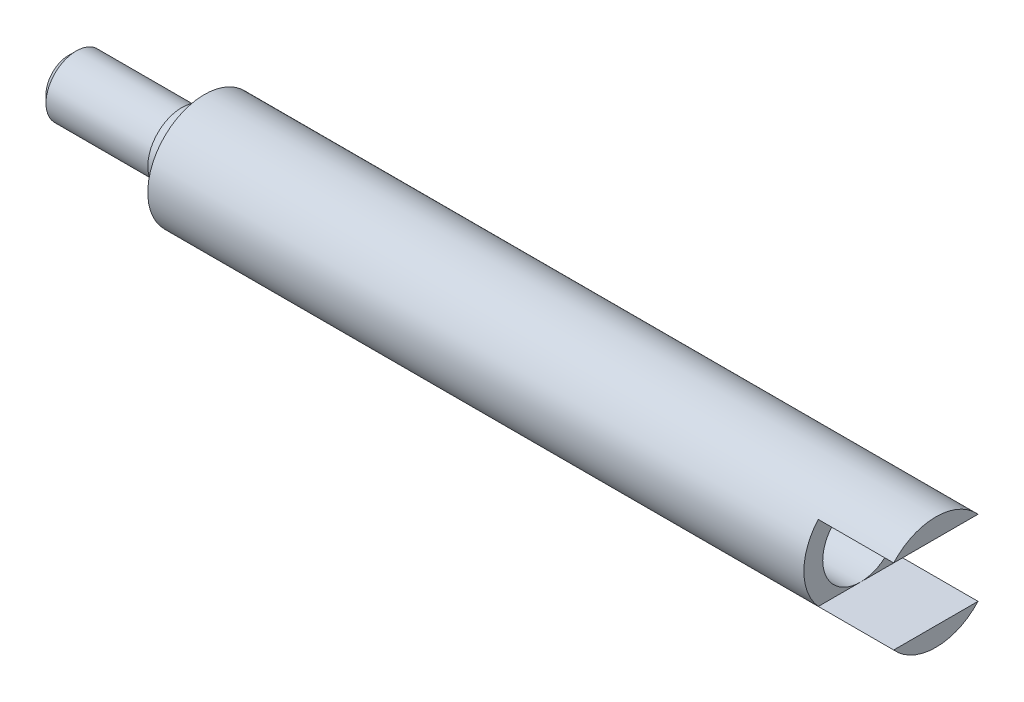
ISO-10303-21;
HEADER;
FILE_DESCRIPTION(('STEP AP214'),'2;1');
FILE_NAME('part.step','',(''),(''),'','','');
FILE_SCHEMA(('AUTOMOTIVE_DESIGN { 1 0 10303 214 1 1 1 1 }'));
ENDSEC;
DATA;
#1=APPLICATION_CONTEXT('core data for automotive mechanical design processes');
#2=APPLICATION_PROTOCOL_DEFINITION('international standard','automotive_design',2000,#1);
#3=PRODUCT_CONTEXT('',#1,'mechanical');
#4=PRODUCT('Part','Part','',(#3));
#5=PRODUCT_RELATED_PRODUCT_CATEGORY('part','',(#4));
#6=PRODUCT_DEFINITION_FORMATION('','',#4);
#7=PRODUCT_DEFINITION_CONTEXT('part definition',#1,'design');
#8=PRODUCT_DEFINITION('design','',#6,#7);
#9=PRODUCT_DEFINITION_SHAPE('','',#8);
#10=(LENGTH_UNIT() NAMED_UNIT(*) SI_UNIT(.MILLI.,.METRE.));
#11=(NAMED_UNIT(*) PLANE_ANGLE_UNIT() SI_UNIT($,.RADIAN.));
#12=(NAMED_UNIT(*) SI_UNIT($,.STERADIAN.) SOLID_ANGLE_UNIT());
#13=UNCERTAINTY_MEASURE_WITH_UNIT(LENGTH_MEASURE(1.E-05),#10,'distance_accuracy_value','');
#14=(GEOMETRIC_REPRESENTATION_CONTEXT(3) GLOBAL_UNCERTAINTY_ASSIGNED_CONTEXT((#13)) GLOBAL_UNIT_ASSIGNED_CONTEXT((#10,
#11,#12)) REPRESENTATION_CONTEXT('',''));
#15=CARTESIAN_POINT('',(0.,0.,0.));
#16=DIRECTION('',(0.,0.,1.));
#17=DIRECTION('',(1.,0.,0.));
#18=AXIS2_PLACEMENT_3D('',#15,#16,#17);
#19=CARTESIAN_POINT('',(210.,0.,0.));
#20=DIRECTION('',(-1.,0.,0.));
#21=DIRECTION('',(0.,0.,1.));
#22=AXIS2_PLACEMENT_3D('',#19,#20,#21);
#23=PLANE('',#22);
#24=DIRECTION('',(0.,0.,1.));
#25=VECTOR('',#24,1.);
#26=CARTESIAN_POINT('',(210.,10.,-15.));
#27=LINE('',#26,#25);
#28=CARTESIAN_POINT('',(210.,10.,-11.180339887499));
#29=VERTEX_POINT('',#28);
#30=CARTESIAN_POINT('',(210.,10.,0.));
#31=VERTEX_POINT('',#30);
#32=EDGE_CURVE('E117',#29,#31,#27,.T.);
#33=ORIENTED_EDGE('',*,*,#32,.T.);
#34=CARTESIAN_POINT('',(210.,0.,0.));
#35=DIRECTION('',(-1.,0.,0.));
#36=DIRECTION('',(0.,0.,1.));
#37=AXIS2_PLACEMENT_3D('',#34,#35,#36);
#38=CIRCLE('',#37,10.);
#39=CARTESIAN_POINT('',(210.,-10.,0.));
#40=VERTEX_POINT('',#39);
#41=EDGE_CURVE('E12',#31,#40,#38,.T.);
#42=ORIENTED_EDGE('',*,*,#41,.T.);
#43=DIRECTION('',(0.,0.,-1.));
#44=VECTOR('',#43,1.);
#45=CARTESIAN_POINT('',(210.,-10.,-15.));
#46=LINE('',#45,#44);
#47=CARTESIAN_POINT('',(210.,-10.,-11.180339887499));
#48=VERTEX_POINT('',#47);
#49=EDGE_CURVE('E114',#40,#48,#46,.T.);
#50=ORIENTED_EDGE('',*,*,#49,.T.);
#51=CARTESIAN_POINT('',(210.,0.,0.));
#52=DIRECTION('',(-1.,0.,0.));
#53=DIRECTION('',(0.,0.,1.));
#54=AXIS2_PLACEMENT_3D('',#51,#52,#53);
#55=CIRCLE('',#54,15.);
#56=EDGE_CURVE('E59',#48,#29,#55,.F.);
#57=ORIENTED_EDGE('',*,*,#56,.T.);
#58=EDGE_LOOP('',(#33,#42,#50,#57));
#59=FACE_BOUND('',#58,.T.);
#60=ADVANCED_FACE('F48',(#59),#23,.F.);
#61=CARTESIAN_POINT('',(230.,15.,0.));
#62=DIRECTION('',(1.,0.,0.));
#63=DIRECTION('',(0.,0.,-1.));
#64=AXIS2_PLACEMENT_3D('',#61,#62,#63);
#65=PLANE('',#64);
#66=DIRECTION('',(0.,0.,1.));
#67=VECTOR('',#66,1.);
#68=CARTESIAN_POINT('',(230.,10.,0.));
#69=LINE('',#68,#67);
#70=CARTESIAN_POINT('',(230.,10.,-11.180339887499));
#71=VERTEX_POINT('',#70);
#72=CARTESIAN_POINT('',(230.,10.,11.180339887499));
#73=VERTEX_POINT('',#72);
#74=EDGE_CURVE('E224',#71,#73,#69,.T.);
#75=ORIENTED_EDGE('',*,*,#74,.F.);
#76=CARTESIAN_POINT('',(230.,0.,0.));
#77=DIRECTION('',(1.,0.,0.));
#78=DIRECTION('',(0.,0.,-1.));
#79=AXIS2_PLACEMENT_3D('',#76,#77,#78);
#80=CIRCLE('',#79,15.);
#81=EDGE_CURVE('E253',#71,#73,#80,.T.);
#82=ORIENTED_EDGE('',*,*,#81,.T.);
#83=EDGE_LOOP('',(#75,#82));
#84=FACE_BOUND('',#83,.T.);
#85=ADVANCED_FACE('F164',(#84),#65,.T.);
#86=CARTESIAN_POINT('',(0.,0.,0.));
#87=DIRECTION('',(-1.,0.,0.));
#88=DIRECTION('',(0.,0.,1.));
#89=AXIS2_PLACEMENT_3D('',#86,#87,#88);
#90=PLANE('',#89);
#91=CARTESIAN_POINT('',(0.,0.,0.));
#92=DIRECTION('',(-1.,0.,0.));
#93=DIRECTION('',(0.,0.,1.));
#94=AXIS2_PLACEMENT_3D('',#91,#92,#93);
#95=CIRCLE('',#94,6.00000000000006);
#96=CARTESIAN_POINT('',(0.,0.,6.00000000000006));
#97=VERTEX_POINT('',#96);
#98=EDGE_CURVE('E216',#97,#97,#95,.T.);
#99=ORIENTED_EDGE('',*,*,#98,.T.);
#100=EDGE_LOOP('',(#99));
#101=FACE_BOUND('',#100,.T.);
#102=ADVANCED_FACE('F168',(#101),#90,.T.);
#103=CARTESIAN_POINT('',(0.,0.,0.));
#104=DIRECTION('',(1.,0.,0.));
#105=DIRECTION('',(0.,0.,-1.));
#106=AXIS2_PLACEMENT_3D('',#103,#104,#105);
#107=CYLINDRICAL_SURFACE('',#106,8.);
#108=CARTESIAN_POINT('',(1.99999999999994,0.,0.));
#109=DIRECTION('',(-1.,0.,0.));
#110=DIRECTION('',(0.,0.,1.));
#111=AXIS2_PLACEMENT_3D('',#108,#109,#110);
#112=CIRCLE('',#111,8.);
#113=CARTESIAN_POINT('',(1.99999999999994,0.,8.));
#114=VERTEX_POINT('',#113);
#115=EDGE_CURVE('E220',#114,#114,#112,.F.);
#116=ORIENTED_EDGE('',*,*,#115,.T.);
#117=EDGE_LOOP('',(#116));
#118=FACE_BOUND('',#117,.T.);
#119=CARTESIAN_POINT('',(30.,0.,0.));
#120=DIRECTION('',(1.,0.,0.));
#121=DIRECTION('',(0.,0.,-1.));
#122=AXIS2_PLACEMENT_3D('',#119,#120,#121);
#123=CIRCLE('',#122,8.);
#124=CARTESIAN_POINT('',(30.,0.,-8.));
#125=VERTEX_POINT('',#124);
#126=EDGE_CURVE('E227',#125,#125,#123,.T.);
#127=ORIENTED_EDGE('',*,*,#126,.F.);
#128=EDGE_LOOP('',(#127));
#129=FACE_BOUND('',#128,.T.);
#130=ADVANCED_FACE('F206',(#118,#129),#107,.T.);
#131=CARTESIAN_POINT('',(30.,8.,0.));
#132=DIRECTION('',(-1.,0.,0.));
#133=DIRECTION('',(0.,0.,1.));
#134=AXIS2_PLACEMENT_3D('',#131,#132,#133);
#135=PLANE('',#134);
#136=ORIENTED_EDGE('',*,*,#126,.T.);
#137=EDGE_LOOP('',(#136));
#138=FACE_BOUND('',#137,.T.);
#139=CARTESIAN_POINT('',(30.,0.,0.));
#140=DIRECTION('',(1.,0.,0.));
#141=DIRECTION('',(0.,0.,-1.));
#142=AXIS2_PLACEMENT_3D('',#139,#140,#141);
#143=CIRCLE('',#142,9.);
#144=CARTESIAN_POINT('',(30.,0.,-9.));
#145=VERTEX_POINT('',#144);
#146=EDGE_CURVE('E280',#145,#145,#143,.T.);
#147=ORIENTED_EDGE('',*,*,#146,.F.);
#148=EDGE_LOOP('',(#147));
#149=FACE_BOUND('',#148,.T.);
#150=ADVANCED_FACE('F202',(#138,#149),#135,.T.);
#151=CARTESIAN_POINT('',(0.,0.,0.));
#152=DIRECTION('',(1.,0.,0.));
#153=DIRECTION('',(0.,0.,-1.));
#154=AXIS2_PLACEMENT_3D('',#151,#152,#153);
#155=CYLINDRICAL_SURFACE('',#154,9.);
#156=ORIENTED_EDGE('',*,*,#146,.T.);
#157=EDGE_LOOP('',(#156));
#158=FACE_BOUND('',#157,.T.);
#159=CARTESIAN_POINT('',(36.,0.,0.));
#160=DIRECTION('',(1.,0.,0.));
#161=DIRECTION('',(0.,0.,-1.));
#162=AXIS2_PLACEMENT_3D('',#159,#160,#161);
#163=CIRCLE('',#162,9.);
#164=CARTESIAN_POINT('',(36.,0.,-9.));
#165=VERTEX_POINT('',#164);
#166=EDGE_CURVE('E275',#165,#165,#163,.T.);
#167=ORIENTED_EDGE('',*,*,#166,.F.);
#168=EDGE_LOOP('',(#167));
#169=FACE_BOUND('',#168,.T.);
#170=ADVANCED_FACE('F198',(#158,#169),#155,.T.);
#171=CARTESIAN_POINT('',(36.,9.,0.));
#172=DIRECTION('',(-1.,0.,0.));
#173=DIRECTION('',(0.,0.,1.));
#174=AXIS2_PLACEMENT_3D('',#171,#172,#173);
#175=PLANE('',#174);
#176=ORIENTED_EDGE('',*,*,#166,.T.);
#177=EDGE_LOOP('',(#176));
#178=FACE_BOUND('',#177,.T.);
#179=CARTESIAN_POINT('',(36.,0.,0.));
#180=DIRECTION('',(1.,0.,0.));
#181=DIRECTION('',(0.,0.,-1.));
#182=AXIS2_PLACEMENT_3D('',#179,#180,#181);
#183=CIRCLE('',#182,15.);
#184=CARTESIAN_POINT('',(36.,0.,-15.));
#185=VERTEX_POINT('',#184);
#186=EDGE_CURVE('E269',#185,#185,#183,.T.);
#187=ORIENTED_EDGE('',*,*,#186,.F.);
#188=EDGE_LOOP('',(#187));
#189=FACE_BOUND('',#188,.T.);
#190=ADVANCED_FACE('F194',(#178,#189),#175,.T.);
#191=CARTESIAN_POINT('',(0.,0.,0.));
#192=DIRECTION('',(1.,0.,0.));
#193=DIRECTION('',(0.,0.,-1.));
#194=AXIS2_PLACEMENT_3D('',#191,#192,#193);
#195=CYLINDRICAL_SURFACE('',#194,15.);
#196=DIRECTION('',(1.,0.,0.));
#197=VECTOR('',#196,1.);
#198=CARTESIAN_POINT('',(0.,10.,-11.180339887499));
#199=LINE('',#198,#197);
#200=EDGE_CURVE('E246',#29,#71,#199,.T.);
#201=ORIENTED_EDGE('',*,*,#200,.F.);
#202=ORIENTED_EDGE('',*,*,#56,.F.);
#203=DIRECTION('',(1.,0.,0.));
#204=VECTOR('',#203,1.);
#205=CARTESIAN_POINT('',(0.,-10.,-11.180339887499));
#206=LINE('',#205,#204);
#207=CARTESIAN_POINT('',(230.,-10.,-11.180339887499));
#208=VERTEX_POINT('',#207);
#209=EDGE_CURVE('E122',#208,#48,#206,.F.);
#210=ORIENTED_EDGE('',*,*,#209,.F.);
#211=CARTESIAN_POINT('',(230.,-10.,11.180339887499));
#212=VERTEX_POINT('',#211);
#213=EDGE_CURVE('E257',#212,#208,#80,.T.);
#214=ORIENTED_EDGE('',*,*,#213,.F.);
#215=DIRECTION('',(1.,0.,0.));
#216=VECTOR('',#215,1.);
#217=CARTESIAN_POINT('',(0.,-10.,11.180339887499));
#218=LINE('',#217,#216);
#219=CARTESIAN_POINT('',(210.,-10.,11.180339887499));
#220=VERTEX_POINT('',#219);
#221=EDGE_CURVE('E77',#220,#212,#218,.T.);
#222=ORIENTED_EDGE('',*,*,#221,.F.);
#223=CARTESIAN_POINT('',(210.,10.,11.180339887499));
#224=VERTEX_POINT('',#223);
#225=EDGE_CURVE('E127',#224,#220,#55,.F.);
#226=ORIENTED_EDGE('',*,*,#225,.F.);
#227=DIRECTION('',(1.,0.,0.));
#228=VECTOR('',#227,1.);
#229=CARTESIAN_POINT('',(0.,10.,11.180339887499));
#230=LINE('',#229,#228);
#231=EDGE_CURVE('E255',#73,#224,#230,.F.);
#232=ORIENTED_EDGE('',*,*,#231,.F.);
#233=ORIENTED_EDGE('',*,*,#81,.F.);
#234=EDGE_LOOP('',(#201,#202,#210,#214,#222,#226,#232,#233));
#235=FACE_BOUND('',#234,.T.);
#236=ORIENTED_EDGE('',*,*,#186,.T.);
#237=EDGE_LOOP('',(#236));
#238=FACE_BOUND('',#237,.T.);
#239=ADVANCED_FACE('F188',(#235,#238),#195,.T.);
#240=DIRECTION('',(0.,0.,-1.));
#241=VECTOR('',#240,1.);
#242=CARTESIAN_POINT('',(230.,-10.,0.));
#243=LINE('',#242,#241);
#244=EDGE_CURVE('E219',#212,#208,#243,.T.);
#245=ORIENTED_EDGE('',*,*,#244,.F.);
#246=ORIENTED_EDGE('',*,*,#213,.T.);
#247=EDGE_LOOP('',(#245,#246));
#248=FACE_BOUND('',#247,.T.);
#249=ADVANCED_FACE('F171',(#248),#65,.T.);
#250=CARTESIAN_POINT('',(1.99999999999994,0.,0.));
#251=DIRECTION('',(1.,0.,0.));
#252=DIRECTION('',(0.,0.,-1.));
#253=AXIS2_PLACEMENT_3D('',#250,#251,#252);
#254=CONICAL_SURFACE('',#253,8.,0.785398163397448);
#255=ORIENTED_EDGE('',*,*,#98,.F.);
#256=EDGE_LOOP('',(#255));
#257=FACE_BOUND('',#256,.T.);
#258=ORIENTED_EDGE('',*,*,#115,.F.);
#259=EDGE_LOOP('',(#258));
#260=FACE_BOUND('',#259,.T.);
#261=ADVANCED_FACE('F51',(#257,#260),#254,.T.);
#262=CARTESIAN_POINT('',(210.,10.,-15.));
#263=DIRECTION('',(0.,1.,0.));
#264=DIRECTION('',(0.,0.,1.));
#265=AXIS2_PLACEMENT_3D('',#262,#263,#264);
#266=PLANE('',#265);
#267=ORIENTED_EDGE('',*,*,#231,.T.);
#268=EDGE_CURVE('E129',#31,#224,#27,.T.);
#269=ORIENTED_EDGE('',*,*,#268,.F.);
#270=ORIENTED_EDGE('',*,*,#32,.F.);
#271=ORIENTED_EDGE('',*,*,#200,.T.);
#272=ORIENTED_EDGE('',*,*,#74,.T.);
#273=EDGE_LOOP('',(#267,#269,#270,#271,#272));
#274=FACE_BOUND('',#273,.T.);
#275=ADVANCED_FACE('F176',(#274),#266,.F.);
#276=CARTESIAN_POINT('',(210.,-10.,-15.));
#277=DIRECTION('',(0.,-1.,0.));
#278=DIRECTION('',(0.,0.,-1.));
#279=AXIS2_PLACEMENT_3D('',#276,#277,#278);
#280=PLANE('',#279);
#281=ORIENTED_EDGE('',*,*,#209,.T.);
#282=ORIENTED_EDGE('',*,*,#49,.F.);
#283=EDGE_CURVE('E120',#220,#40,#46,.T.);
#284=ORIENTED_EDGE('',*,*,#283,.F.);
#285=ORIENTED_EDGE('',*,*,#221,.T.);
#286=ORIENTED_EDGE('',*,*,#244,.T.);
#287=EDGE_LOOP('',(#281,#282,#284,#285,#286));
#288=FACE_BOUND('',#287,.T.);
#289=ADVANCED_FACE('F119',(#288),#280,.F.);
#290=ORIENTED_EDGE('',*,*,#283,.T.);
#291=CARTESIAN_POINT('',(210.,0.,0.));
#292=DIRECTION('',(1.,0.,0.));
#293=DIRECTION('',(0.,0.,-1.));
#294=AXIS2_PLACEMENT_3D('',#291,#292,#293);
#295=CIRCLE('',#294,10.);
#296=EDGE_CURVE('E104',#31,#40,#295,.T.);
#297=ORIENTED_EDGE('',*,*,#296,.F.);
#298=ORIENTED_EDGE('',*,*,#268,.T.);
#299=ORIENTED_EDGE('',*,*,#225,.T.);
#300=EDGE_LOOP('',(#290,#297,#298,#299));
#301=FACE_BOUND('',#300,.T.);
#302=ADVANCED_FACE('F125',(#301),#23,.F.);
#303=CARTESIAN_POINT('',(50.,0.,0.));
#304=DIRECTION('',(1.,0.,0.));
#305=DIRECTION('',(0.,0.,-1.));
#306=AXIS2_PLACEMENT_3D('',#303,#304,#305);
#307=CYLINDRICAL_SURFACE('',#306,10.);
#308=CARTESIAN_POINT('',(50.,0.,0.));
#309=DIRECTION('',(1.,0.,0.));
#310=DIRECTION('',(0.,0.,-1.));
#311=AXIS2_PLACEMENT_3D('',#308,#309,#310);
#312=CIRCLE('',#311,10.);
#313=CARTESIAN_POINT('',(50.,0.,-10.));
#314=VERTEX_POINT('',#313);
#315=EDGE_CURVE('E110',#314,#314,#312,.T.);
#316=ORIENTED_EDGE('',*,*,#315,.F.);
#317=EDGE_LOOP('',(#316));
#318=FACE_BOUND('',#317,.T.);
#319=ORIENTED_EDGE('',*,*,#296,.T.);
#320=ORIENTED_EDGE('',*,*,#41,.F.);
#321=EDGE_LOOP('',(#319,#320));
#322=FACE_BOUND('',#321,.T.);
#323=ADVANCED_FACE('F105',(#318,#322),#307,.F.);
#324=CARTESIAN_POINT('',(50.,0.,0.));
#325=DIRECTION('',(1.,0.,0.));
#326=DIRECTION('',(0.,0.,-1.));
#327=AXIS2_PLACEMENT_3D('',#324,#325,#326);
#328=PLANE('',#327);
#329=ORIENTED_EDGE('',*,*,#315,.T.);
#330=EDGE_LOOP('',(#329));
#331=FACE_BOUND('',#330,.T.);
#332=ADVANCED_FACE('F152',(#331),#328,.T.);
#333=CLOSED_SHELL('',(#60,#85,#102,#130,#150,#170,#190,#239,#249,#261,#275,#289,#302,#323,#332));
#334=MANIFOLD_SOLID_BREP('B2',#333);
#335=ADVANCED_BREP_SHAPE_REPRESENTATION('',(#18,#334),#14);
#336=SHAPE_DEFINITION_REPRESENTATION(#9,#335);
ENDSEC;
END-ISO-10303-21;
